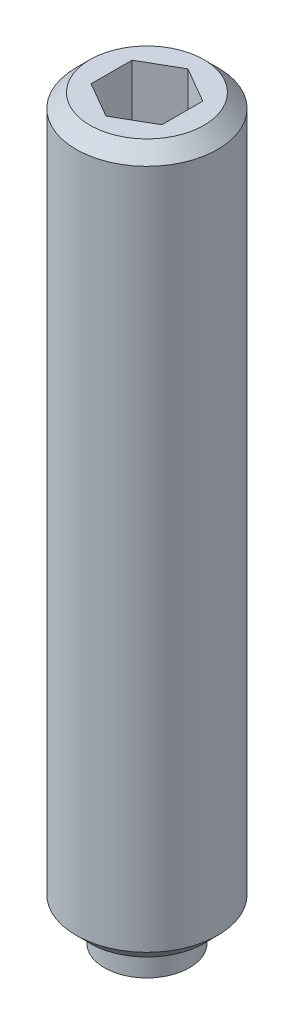
ISO-10303-21;
HEADER;
FILE_DESCRIPTION(('STEP AP214'),'2;1');
FILE_NAME('part.step','',(''),(''),'','','');
FILE_SCHEMA(('AUTOMOTIVE_DESIGN { 1 0 10303 214 1 1 1 1 }'));
ENDSEC;
DATA;
#1=APPLICATION_CONTEXT('core data for automotive mechanical design processes');
#2=APPLICATION_PROTOCOL_DEFINITION('international standard','automotive_design',2000,#1);
#3=PRODUCT_CONTEXT('',#1,'mechanical');
#4=PRODUCT('Part','Part','',(#3));
#5=PRODUCT_RELATED_PRODUCT_CATEGORY('part','',(#4));
#6=PRODUCT_DEFINITION_FORMATION('','',#4);
#7=PRODUCT_DEFINITION_CONTEXT('part definition',#1,'design');
#8=PRODUCT_DEFINITION('design','',#6,#7);
#9=PRODUCT_DEFINITION_SHAPE('','',#8);
#10=(LENGTH_UNIT() NAMED_UNIT(*) SI_UNIT(.MILLI.,.METRE.));
#11=(NAMED_UNIT(*) PLANE_ANGLE_UNIT() SI_UNIT($,.RADIAN.));
#12=(NAMED_UNIT(*) SI_UNIT($,.STERADIAN.) SOLID_ANGLE_UNIT());
#13=UNCERTAINTY_MEASURE_WITH_UNIT(LENGTH_MEASURE(1.E-05),#10,'distance_accuracy_value','');
#14=(GEOMETRIC_REPRESENTATION_CONTEXT(3) GLOBAL_UNCERTAINTY_ASSIGNED_CONTEXT((#13)) GLOBAL_UNIT_ASSIGNED_CONTEXT((#10,
#11,#12)) REPRESENTATION_CONTEXT('',''));
#15=CARTESIAN_POINT('',(0.,0.,0.));
#16=DIRECTION('',(0.,0.,1.));
#17=DIRECTION('',(1.,0.,0.));
#18=AXIS2_PLACEMENT_3D('',#15,#16,#17);
#19=CARTESIAN_POINT('',(1.00475,26.,0.));
#20=DIRECTION('',(0.,1.,0.));
#21=DIRECTION('',(1.,0.,0.));
#22=AXIS2_PLACEMENT_3D('',#19,#20,#21);
#23=PLANE('',#22);
#24=DIRECTION('',(-0.866025403784439,0.,-0.5));
#25=VECTOR('',#24,1.);
#26=CARTESIAN_POINT('',(-0.56071875,26.,1.11964455172189));
#27=LINE('',#26,#25);
#28=CARTESIAN_POINT('',(0.,26.,1.44337567297406));
#29=VERTEX_POINT('',#28);
#30=CARTESIAN_POINT('',(-1.25,26.,0.721687836487032));
#31=VERTEX_POINT('',#30);
#32=EDGE_CURVE('E134',#29,#31,#27,.T.);
#33=ORIENTED_EDGE('',*,*,#32,.T.);
#34=DIRECTION('',(0.,0.,-1.));
#35=VECTOR('',#34,1.);
#36=CARTESIAN_POINT('',(-1.25,26.,-0.360843918243516));
#37=LINE('',#36,#35);
#38=CARTESIAN_POINT('',(-1.25,26.,-0.721687836487032));
#39=VERTEX_POINT('',#38);
#40=EDGE_CURVE('E11',#31,#39,#37,.T.);
#41=ORIENTED_EDGE('',*,*,#40,.T.);
#42=DIRECTION('',(0.866025403784439,0.,-0.5));
#43=VECTOR('',#42,1.);
#44=CARTESIAN_POINT('',(0.06428125,26.,-1.48048846996541));
#45=LINE('',#44,#43);
#46=CARTESIAN_POINT('',(0.,26.,-1.44337567297406));
#47=VERTEX_POINT('',#46);
#48=EDGE_CURVE('E133',#39,#47,#45,.T.);
#49=ORIENTED_EDGE('',*,*,#48,.T.);
#50=DIRECTION('',(0.866025403784439,0.,0.5));
#51=VECTOR('',#50,1.);
#52=CARTESIAN_POINT('',(1.31428125,26.,-0.684575039495687));
#53=LINE('',#52,#51);
#54=CARTESIAN_POINT('',(1.25,26.,-0.721687836487032));
#55=VERTEX_POINT('',#54);
#56=EDGE_CURVE('E20',#47,#55,#53,.T.);
#57=ORIENTED_EDGE('',*,*,#56,.T.);
#58=DIRECTION('',(0.,0.,1.));
#59=VECTOR('',#58,1.);
#60=CARTESIAN_POINT('',(1.25,26.,0.360843918243516));
#61=LINE('',#60,#59);
#62=CARTESIAN_POINT('',(1.25,26.,0.721687836487032));
#63=VERTEX_POINT('',#62);
#64=EDGE_CURVE('E194',#55,#63,#61,.T.);
#65=ORIENTED_EDGE('',*,*,#64,.T.);
#66=DIRECTION('',(-0.866025403784439,0.,0.5));
#67=VECTOR('',#66,1.);
#68=CARTESIAN_POINT('',(0.68928125,26.,1.0454189577392));
#69=LINE('',#68,#67);
#70=EDGE_CURVE('E173',#63,#29,#69,.T.);
#71=ORIENTED_EDGE('',*,*,#70,.T.);
#72=EDGE_LOOP('',(#33,#41,#49,#57,#65,#71));
#73=FACE_BOUND('',#72,.T.);
#74=CARTESIAN_POINT('',(0.,26.,0.));
#75=DIRECTION('',(0.,1.,0.));
#76=DIRECTION('',(1.,0.,0.));
#77=AXIS2_PLACEMENT_3D('',#74,#75,#76);
#78=CIRCLE('',#77,2.0095);
#79=CARTESIAN_POINT('',(-2.0095,26.,0.));
#80=VERTEX_POINT('',#79);
#81=EDGE_CURVE('E244',#80,#80,#78,.T.);
#82=ORIENTED_EDGE('',*,*,#81,.T.);
#83=EDGE_LOOP('',(#82));
#84=FACE_BOUND('',#83,.T.);
#85=ADVANCED_FACE('F16',(#73,#84),#23,.T.);
#86=CARTESIAN_POINT('',(1.75475,1.,0.));
#87=DIRECTION('',(0.,-1.,0.));
#88=DIRECTION('',(0.,0.,-1.));
#89=AXIS2_PLACEMENT_3D('',#86,#87,#88);
#90=PLANE('',#89);
#91=CARTESIAN_POINT('',(0.,1.,0.));
#92=DIRECTION('',(0.,1.,0.));
#93=DIRECTION('',(1.,0.,0.));
#94=AXIS2_PLACEMENT_3D('',#91,#92,#93);
#95=CIRCLE('',#94,1.5);
#96=CARTESIAN_POINT('',(-1.5,1.,0.));
#97=VERTEX_POINT('',#96);
#98=EDGE_CURVE('E102',#97,#97,#95,.T.);
#99=ORIENTED_EDGE('',*,*,#98,.T.);
#100=EDGE_LOOP('',(#99));
#101=FACE_BOUND('',#100,.T.);
#102=CARTESIAN_POINT('',(0.,1.,0.));
#103=DIRECTION('',(0.,1.,0.));
#104=DIRECTION('',(1.,0.,0.));
#105=AXIS2_PLACEMENT_3D('',#102,#103,#104);
#106=CIRCLE('',#105,2.0095);
#107=CARTESIAN_POINT('',(-2.0095,1.,0.));
#108=VERTEX_POINT('',#107);
#109=EDGE_CURVE('E111',#108,#108,#106,.T.);
#110=ORIENTED_EDGE('',*,*,#109,.F.);
#111=EDGE_LOOP('',(#110));
#112=FACE_BOUND('',#111,.T.);
#113=ADVANCED_FACE('F380',(#101,#112),#90,.T.);
#114=CARTESIAN_POINT('',(0.75,0.,0.));
#115=DIRECTION('',(0.,-1.,0.));
#116=DIRECTION('',(0.,0.,-1.));
#117=AXIS2_PLACEMENT_3D('',#114,#115,#116);
#118=PLANE('',#117);
#119=CARTESIAN_POINT('',(0.,0.,0.));
#120=DIRECTION('',(0.,1.,0.));
#121=DIRECTION('',(1.,0.,0.));
#122=AXIS2_PLACEMENT_3D('',#119,#120,#121);
#123=CIRCLE('',#122,1.5);
#124=CARTESIAN_POINT('',(-1.5,0.,0.));
#125=VERTEX_POINT('',#124);
#126=EDGE_CURVE('E166',#125,#125,#123,.T.);
#127=ORIENTED_EDGE('',*,*,#126,.F.);
#128=EDGE_LOOP('',(#127));
#129=FACE_BOUND('',#128,.T.);
#130=ADVANCED_FACE('F385',(#129),#118,.T.);
#131=CARTESIAN_POINT('',(-1.25,28.5,-0.721687836487032));
#132=DIRECTION('',(-1.,0.,0.));
#133=DIRECTION('',(0.,0.,1.));
#134=AXIS2_PLACEMENT_3D('',#131,#132,#133);
#135=PLANE('',#134);
#136=ORIENTED_EDGE('',*,*,#40,.F.);
#137=DIRECTION('',(0.,-1.,0.));
#138=VECTOR('',#137,1.);
#139=CARTESIAN_POINT('',(-1.25,28.5,0.721687836487032));
#140=LINE('',#139,#138);
#141=CARTESIAN_POINT('',(-1.25,23.5,0.721687836487032));
#142=VERTEX_POINT('',#141);
#143=EDGE_CURVE('E124',#31,#142,#140,.T.);
#144=ORIENTED_EDGE('',*,*,#143,.T.);
#145=DIRECTION('',(0.,0.,1.));
#146=VECTOR('',#145,1.);
#147=CARTESIAN_POINT('',(-1.25,23.5,-0.721687836487032));
#148=LINE('',#147,#146);
#149=CARTESIAN_POINT('',(-1.25,23.5,0.));
#150=VERTEX_POINT('',#149);
#151=EDGE_CURVE('E129',#150,#142,#148,.T.);
#152=ORIENTED_EDGE('',*,*,#151,.F.);
#153=DIRECTION('',(0.,0.,1.));
#154=VECTOR('',#153,1.);
#155=CARTESIAN_POINT('',(-1.25,23.5,-0.721687836487032));
#156=LINE('',#155,#154);
#157=CARTESIAN_POINT('',(-1.25,23.5,-0.721687836487032));
#158=VERTEX_POINT('',#157);
#159=EDGE_CURVE('E182',#158,#150,#156,.T.);
#160=ORIENTED_EDGE('',*,*,#159,.F.);
#161=DIRECTION('',(0.,-1.,0.));
#162=VECTOR('',#161,1.);
#163=CARTESIAN_POINT('',(-1.25,28.5,-0.721687836487032));
#164=LINE('',#163,#162);
#165=EDGE_CURVE('E27',#39,#158,#164,.T.);
#166=ORIENTED_EDGE('',*,*,#165,.F.);
#167=EDGE_LOOP('',(#136,#144,#152,#160,#166));
#168=FACE_BOUND('',#167,.T.);
#169=ADVANCED_FACE('F126',(#168),#135,.F.);
#170=CARTESIAN_POINT('',(0.,28.5,-1.44337567297406));
#171=DIRECTION('',(-0.5,0.,-0.866025403784439));
#172=DIRECTION('',(-0.866025403784439,0.,0.5));
#173=AXIS2_PLACEMENT_3D('',#170,#171,#172);
#174=PLANE('',#173);
#175=ORIENTED_EDGE('',*,*,#48,.F.);
#176=ORIENTED_EDGE('',*,*,#165,.T.);
#177=DIRECTION('',(-0.866025403784439,0.,0.5));
#178=VECTOR('',#177,1.);
#179=CARTESIAN_POINT('',(0.,23.5,-1.44337567297406));
#180=LINE('',#179,#178);
#181=CARTESIAN_POINT('',(-0.625,23.5,-1.08253175473055));
#182=VERTEX_POINT('',#181);
#183=EDGE_CURVE('E220',#182,#158,#180,.T.);
#184=ORIENTED_EDGE('',*,*,#183,.F.);
#185=DIRECTION('',(-0.866025403784439,0.,0.5));
#186=VECTOR('',#185,1.);
#187=CARTESIAN_POINT('',(0.,23.5,-1.44337567297406));
#188=LINE('',#187,#186);
#189=CARTESIAN_POINT('',(0.,23.5,-1.44337567297406));
#190=VERTEX_POINT('',#189);
#191=EDGE_CURVE('E181',#190,#182,#188,.T.);
#192=ORIENTED_EDGE('',*,*,#191,.F.);
#193=DIRECTION('',(0.,-1.,0.));
#194=VECTOR('',#193,1.);
#195=CARTESIAN_POINT('',(0.,28.5,-1.44337567297406));
#196=LINE('',#195,#194);
#197=EDGE_CURVE('E195',#47,#190,#196,.T.);
#198=ORIENTED_EDGE('',*,*,#197,.F.);
#199=EDGE_LOOP('',(#175,#176,#184,#192,#198));
#200=FACE_BOUND('',#199,.T.);
#201=ADVANCED_FACE('F340',(#200),#174,.F.);
#202=CARTESIAN_POINT('',(-1.25,28.5,0.721687836487032));
#203=DIRECTION('',(-0.5,0.,0.866025403784439));
#204=DIRECTION('',(0.,1.,0.));
#205=AXIS2_PLACEMENT_3D('',#202,#203,#204);
#206=PLANE('',#205);
#207=ORIENTED_EDGE('',*,*,#32,.F.);
#208=DIRECTION('',(0.,-1.,0.));
#209=VECTOR('',#208,1.);
#210=CARTESIAN_POINT('',(0.,28.5,1.44337567297406));
#211=LINE('',#210,#209);
#212=CARTESIAN_POINT('',(0.,23.5,1.44337567297406));
#213=VERTEX_POINT('',#212);
#214=EDGE_CURVE('E170',#29,#213,#211,.T.);
#215=ORIENTED_EDGE('',*,*,#214,.T.);
#216=DIRECTION('',(0.866025403784439,0.,0.5));
#217=VECTOR('',#216,1.);
#218=CARTESIAN_POINT('',(-1.25,23.5,0.721687836487032));
#219=LINE('',#218,#217);
#220=CARTESIAN_POINT('',(-0.625,23.5,1.08253175473055));
#221=VERTEX_POINT('',#220);
#222=EDGE_CURVE('E141',#221,#213,#219,.T.);
#223=ORIENTED_EDGE('',*,*,#222,.F.);
#224=DIRECTION('',(0.866025403784439,0.,0.5));
#225=VECTOR('',#224,1.);
#226=CARTESIAN_POINT('',(-1.25,23.5,0.721687836487032));
#227=LINE('',#226,#225);
#228=EDGE_CURVE('E138',#142,#221,#227,.T.);
#229=ORIENTED_EDGE('',*,*,#228,.F.);
#230=ORIENTED_EDGE('',*,*,#143,.F.);
#231=EDGE_LOOP('',(#207,#215,#223,#229,#230));
#232=FACE_BOUND('',#231,.T.);
#233=ADVANCED_FACE('F139',(#232),#206,.F.);
#234=CARTESIAN_POINT('',(0.,28.5,1.44337567297406));
#235=DIRECTION('',(0.5,0.,0.866025403784439));
#236=DIRECTION('',(0.,-1.,0.));
#237=AXIS2_PLACEMENT_3D('',#234,#235,#236);
#238=PLANE('',#237);
#239=ORIENTED_EDGE('',*,*,#70,.F.);
#240=DIRECTION('',(0.,-1.,0.));
#241=VECTOR('',#240,1.);
#242=CARTESIAN_POINT('',(1.25,28.5,0.721687836487032));
#243=LINE('',#242,#241);
#244=CARTESIAN_POINT('',(1.25,23.5,0.721687836487032));
#245=VERTEX_POINT('',#244);
#246=EDGE_CURVE('E185',#63,#245,#243,.T.);
#247=ORIENTED_EDGE('',*,*,#246,.T.);
#248=DIRECTION('',(0.866025403784439,0.,-0.5));
#249=VECTOR('',#248,1.);
#250=CARTESIAN_POINT('',(0.,23.5,1.44337567297406));
#251=LINE('',#250,#249);
#252=CARTESIAN_POINT('',(0.625,23.5,1.08253175473055));
#253=VERTEX_POINT('',#252);
#254=EDGE_CURVE('E200',#253,#245,#251,.T.);
#255=ORIENTED_EDGE('',*,*,#254,.F.);
#256=DIRECTION('',(0.866025403784439,0.,-0.5));
#257=VECTOR('',#256,1.);
#258=CARTESIAN_POINT('',(0.,23.5,1.44337567297406));
#259=LINE('',#258,#257);
#260=EDGE_CURVE('E152',#213,#253,#259,.T.);
#261=ORIENTED_EDGE('',*,*,#260,.F.);
#262=ORIENTED_EDGE('',*,*,#214,.F.);
#263=EDGE_LOOP('',(#239,#247,#255,#261,#262));
#264=FACE_BOUND('',#263,.T.);
#265=ADVANCED_FACE('F258',(#264),#238,.F.);
#266=CARTESIAN_POINT('',(1.25,28.5,0.721687836487032));
#267=DIRECTION('',(1.,0.,0.));
#268=DIRECTION('',(0.,1.,0.));
#269=AXIS2_PLACEMENT_3D('',#266,#267,#268);
#270=PLANE('',#269);
#271=ORIENTED_EDGE('',*,*,#64,.F.);
#272=DIRECTION('',(0.,-1.,0.));
#273=VECTOR('',#272,1.);
#274=CARTESIAN_POINT('',(1.25,28.5,-0.721687836487032));
#275=LINE('',#274,#273);
#276=CARTESIAN_POINT('',(1.25,23.5,-0.721687836487032));
#277=VERTEX_POINT('',#276);
#278=EDGE_CURVE('E191',#55,#277,#275,.T.);
#279=ORIENTED_EDGE('',*,*,#278,.T.);
#280=DIRECTION('',(0.,0.,-1.));
#281=VECTOR('',#280,1.);
#282=CARTESIAN_POINT('',(1.25,23.5,0.721687836487032));
#283=LINE('',#282,#281);
#284=CARTESIAN_POINT('',(1.25,23.5,0.));
#285=VERTEX_POINT('',#284);
#286=EDGE_CURVE('E211',#285,#277,#283,.T.);
#287=ORIENTED_EDGE('',*,*,#286,.F.);
#288=DIRECTION('',(0.,0.,-1.));
#289=VECTOR('',#288,1.);
#290=CARTESIAN_POINT('',(1.25,23.5,0.721687836487032));
#291=LINE('',#290,#289);
#292=EDGE_CURVE('E204',#245,#285,#291,.T.);
#293=ORIENTED_EDGE('',*,*,#292,.F.);
#294=ORIENTED_EDGE('',*,*,#246,.F.);
#295=EDGE_LOOP('',(#271,#279,#287,#293,#294));
#296=FACE_BOUND('',#295,.T.);
#297=ADVANCED_FACE('F265',(#296),#270,.F.);
#298=CARTESIAN_POINT('',(1.25,28.5,-0.721687836487032));
#299=DIRECTION('',(0.5,0.,-0.866025403784439));
#300=DIRECTION('',(0.,-1.,0.));
#301=AXIS2_PLACEMENT_3D('',#298,#299,#300);
#302=PLANE('',#301);
#303=ORIENTED_EDGE('',*,*,#56,.F.);
#304=ORIENTED_EDGE('',*,*,#197,.T.);
#305=DIRECTION('',(-0.866025403784439,0.,-0.5));
#306=VECTOR('',#305,1.);
#307=CARTESIAN_POINT('',(1.25,23.5,-0.721687836487032));
#308=LINE('',#307,#306);
#309=CARTESIAN_POINT('',(0.625,23.5,-1.08253175473055));
#310=VERTEX_POINT('',#309);
#311=EDGE_CURVE('E177',#310,#190,#308,.T.);
#312=ORIENTED_EDGE('',*,*,#311,.F.);
#313=DIRECTION('',(-0.866025403784439,0.,-0.5));
#314=VECTOR('',#313,1.);
#315=CARTESIAN_POINT('',(1.25,23.5,-0.721687836487032));
#316=LINE('',#315,#314);
#317=EDGE_CURVE('E205',#277,#310,#316,.T.);
#318=ORIENTED_EDGE('',*,*,#317,.F.);
#319=ORIENTED_EDGE('',*,*,#278,.F.);
#320=EDGE_LOOP('',(#303,#304,#312,#318,#319));
#321=FACE_BOUND('',#320,.T.);
#322=ADVANCED_FACE('F303',(#321),#302,.F.);
#323=CARTESIAN_POINT('',(0.,23.5,0.));
#324=DIRECTION('',(0.,1.,0.));
#325=DIRECTION('',(1.,0.,0.));
#326=AXIS2_PLACEMENT_3D('',#323,#324,#325);
#327=PLANE('',#326);
#328=CARTESIAN_POINT('',(0.,23.5,0.));
#329=DIRECTION('',(0.,-1.,0.));
#330=DIRECTION('',(1.,0.,0.));
#331=AXIS2_PLACEMENT_3D('',#328,#329,#330);
#332=CIRCLE('',#331,1.25);
#333=EDGE_CURVE('E149',#221,#150,#332,.T.);
#334=ORIENTED_EDGE('',*,*,#333,.T.);
#335=ORIENTED_EDGE('',*,*,#151,.T.);
#336=ORIENTED_EDGE('',*,*,#228,.T.);
#337=EDGE_LOOP('',(#334,#335,#336));
#338=FACE_BOUND('',#337,.T.);
#339=ADVANCED_FACE('F147',(#338),#327,.T.);
#340=CARTESIAN_POINT('',(0.,23.5,0.));
#341=DIRECTION('',(0.,1.,0.));
#342=DIRECTION('',(1.,0.,0.));
#343=AXIS2_PLACEMENT_3D('',#340,#341,#342);
#344=PLANE('',#343);
#345=CARTESIAN_POINT('',(0.,23.5,0.));
#346=DIRECTION('',(0.,-1.,0.));
#347=DIRECTION('',(1.,0.,0.));
#348=AXIS2_PLACEMENT_3D('',#345,#346,#347);
#349=CIRCLE('',#348,1.25);
#350=EDGE_CURVE('E218',#253,#221,#349,.T.);
#351=ORIENTED_EDGE('',*,*,#350,.T.);
#352=ORIENTED_EDGE('',*,*,#222,.T.);
#353=ORIENTED_EDGE('',*,*,#260,.T.);
#354=EDGE_LOOP('',(#351,#352,#353));
#355=FACE_BOUND('',#354,.T.);
#356=ADVANCED_FACE('F367',(#355),#344,.T.);
#357=CARTESIAN_POINT('',(0.,23.5,0.));
#358=DIRECTION('',(0.,1.,0.));
#359=DIRECTION('',(1.,0.,0.));
#360=AXIS2_PLACEMENT_3D('',#357,#358,#359);
#361=PLANE('',#360);
#362=CARTESIAN_POINT('',(0.,23.5,0.));
#363=DIRECTION('',(0.,-1.,0.));
#364=DIRECTION('',(1.,0.,0.));
#365=AXIS2_PLACEMENT_3D('',#362,#363,#364);
#366=CIRCLE('',#365,1.25);
#367=EDGE_CURVE('E169',#285,#253,#366,.T.);
#368=ORIENTED_EDGE('',*,*,#367,.T.);
#369=ORIENTED_EDGE('',*,*,#254,.T.);
#370=ORIENTED_EDGE('',*,*,#292,.T.);
#371=EDGE_LOOP('',(#368,#369,#370));
#372=FACE_BOUND('',#371,.T.);
#373=ADVANCED_FACE('F267',(#372),#361,.T.);
#374=CARTESIAN_POINT('',(0.,23.5,0.));
#375=DIRECTION('',(0.,1.,0.));
#376=DIRECTION('',(1.,0.,0.));
#377=AXIS2_PLACEMENT_3D('',#374,#375,#376);
#378=PLANE('',#377);
#379=CARTESIAN_POINT('',(0.,23.5,0.));
#380=DIRECTION('',(0.,-1.,0.));
#381=DIRECTION('',(1.,0.,0.));
#382=AXIS2_PLACEMENT_3D('',#379,#380,#381);
#383=CIRCLE('',#382,1.25);
#384=EDGE_CURVE('E199',#310,#285,#383,.T.);
#385=ORIENTED_EDGE('',*,*,#384,.T.);
#386=ORIENTED_EDGE('',*,*,#286,.T.);
#387=ORIENTED_EDGE('',*,*,#317,.T.);
#388=EDGE_LOOP('',(#385,#386,#387));
#389=FACE_BOUND('',#388,.T.);
#390=ADVANCED_FACE('F414',(#389),#378,.T.);
#391=CARTESIAN_POINT('',(0.,23.5,0.));
#392=DIRECTION('',(0.,1.,0.));
#393=DIRECTION('',(1.,0.,0.));
#394=AXIS2_PLACEMENT_3D('',#391,#392,#393);
#395=PLANE('',#394);
#396=CARTESIAN_POINT('',(0.,23.5,0.));
#397=DIRECTION('',(0.,-1.,0.));
#398=DIRECTION('',(1.,0.,0.));
#399=AXIS2_PLACEMENT_3D('',#396,#397,#398);
#400=CIRCLE('',#399,1.25);
#401=EDGE_CURVE('E165',#182,#310,#400,.T.);
#402=ORIENTED_EDGE('',*,*,#401,.T.);
#403=ORIENTED_EDGE('',*,*,#311,.T.);
#404=ORIENTED_EDGE('',*,*,#191,.T.);
#405=EDGE_LOOP('',(#402,#403,#404));
#406=FACE_BOUND('',#405,.T.);
#407=ADVANCED_FACE('F419',(#406),#395,.T.);
#408=CARTESIAN_POINT('',(0.,23.5,0.));
#409=DIRECTION('',(0.,1.,0.));
#410=DIRECTION('',(1.,0.,0.));
#411=AXIS2_PLACEMENT_3D('',#408,#409,#410);
#412=PLANE('',#411);
#413=CARTESIAN_POINT('',(0.,23.5,0.));
#414=DIRECTION('',(0.,-1.,0.));
#415=DIRECTION('',(1.,0.,0.));
#416=AXIS2_PLACEMENT_3D('',#413,#414,#415);
#417=CIRCLE('',#416,1.25);
#418=EDGE_CURVE('E162',#150,#182,#417,.T.);
#419=ORIENTED_EDGE('',*,*,#418,.T.);
#420=ORIENTED_EDGE('',*,*,#183,.T.);
#421=ORIENTED_EDGE('',*,*,#159,.T.);
#422=EDGE_LOOP('',(#419,#420,#421));
#423=FACE_BOUND('',#422,.T.);
#424=ADVANCED_FACE('F295',(#423),#412,.T.);
#425=CARTESIAN_POINT('',(0.,23.1391560817565,0.));
#426=DIRECTION('',(0.,1.,0.));
#427=DIRECTION('',(1.,0.,0.));
#428=AXIS2_PLACEMENT_3D('',#425,#426,#427);
#429=CONICAL_SURFACE('',#428,0.625,1.0471975511966);
#430=CARTESIAN_POINT('',(0.,22.778312163513,0.));
#431=VERTEX_POINT('',#430);
#432=VERTEX_LOOP('',#431);
#433=FACE_BOUND('',#432,.T.);
#434=ORIENTED_EDGE('',*,*,#367,.F.);
#435=ORIENTED_EDGE('',*,*,#384,.F.);
#436=ORIENTED_EDGE('',*,*,#401,.F.);
#437=ORIENTED_EDGE('',*,*,#418,.F.);
#438=ORIENTED_EDGE('',*,*,#333,.F.);
#439=ORIENTED_EDGE('',*,*,#350,.F.);
#440=EDGE_LOOP('',(#434,#435,#436,#437,#438,#439));
#441=FACE_BOUND('',#440,.T.);
#442=ADVANCED_FACE('F18',(#433,#441),#429,.F.);
#443=CARTESIAN_POINT('',(0.,0.5,0.));
#444=DIRECTION('',(0.,-1.,0.));
#445=DIRECTION('',(1.,0.,0.));
#446=AXIS2_PLACEMENT_3D('',#443,#444,#445);
#447=CYLINDRICAL_SURFACE('',#446,1.5);
#448=ORIENTED_EDGE('',*,*,#126,.T.);
#449=EDGE_LOOP('',(#448));
#450=FACE_BOUND('',#449,.T.);
#451=ORIENTED_EDGE('',*,*,#98,.F.);
#452=EDGE_LOOP('',(#451));
#453=FACE_BOUND('',#452,.T.);
#454=ADVANCED_FACE('F294',(#450,#453),#447,.T.);
#455=CARTESIAN_POINT('',(0.,1.24525,0.));
#456=DIRECTION('',(0.,1.,0.));
#457=DIRECTION('',(1.,0.,0.));
#458=AXIS2_PLACEMENT_3D('',#455,#456,#457);
#459=CONICAL_SURFACE('',#458,2.25475,0.785398163397447);
#460=ORIENTED_EDGE('',*,*,#109,.T.);
#461=EDGE_LOOP('',(#460));
#462=FACE_BOUND('',#461,.T.);
#463=CARTESIAN_POINT('',(0.,1.4905,0.));
#464=DIRECTION('',(0.,1.,0.));
#465=DIRECTION('',(1.,0.,0.));
#466=AXIS2_PLACEMENT_3D('',#463,#464,#465);
#467=CIRCLE('',#466,2.5);
#468=CARTESIAN_POINT('',(-2.5,1.4905,0.));
#469=VERTEX_POINT('',#468);
#470=EDGE_CURVE('E174',#469,#469,#467,.T.);
#471=ORIENTED_EDGE('',*,*,#470,.F.);
#472=EDGE_LOOP('',(#471));
#473=FACE_BOUND('',#472,.T.);
#474=ADVANCED_FACE('F317',(#462,#473),#459,.T.);
#475=CARTESIAN_POINT('',(0.,13.5,0.));
#476=DIRECTION('',(0.,-1.,0.));
#477=DIRECTION('',(1.,0.,0.));
#478=AXIS2_PLACEMENT_3D('',#475,#476,#477);
#479=CYLINDRICAL_SURFACE('',#478,2.5);
#480=ORIENTED_EDGE('',*,*,#470,.T.);
#481=EDGE_LOOP('',(#480));
#482=FACE_BOUND('',#481,.T.);
#483=CARTESIAN_POINT('',(0.,25.5095,0.));
#484=DIRECTION('',(0.,1.,0.));
#485=DIRECTION('',(1.,0.,0.));
#486=AXIS2_PLACEMENT_3D('',#483,#484,#485);
#487=CIRCLE('',#486,2.5);
#488=CARTESIAN_POINT('',(-2.5,25.5095,0.));
#489=VERTEX_POINT('',#488);
#490=EDGE_CURVE('E161',#489,#489,#487,.T.);
#491=ORIENTED_EDGE('',*,*,#490,.F.);
#492=EDGE_LOOP('',(#491));
#493=FACE_BOUND('',#492,.T.);
#494=ADVANCED_FACE('F324',(#482,#493),#479,.T.);
#495=CARTESIAN_POINT('',(0.,25.75475,0.));
#496=DIRECTION('',(0.,-1.,0.));
#497=DIRECTION('',(1.,0.,0.));
#498=AXIS2_PLACEMENT_3D('',#495,#496,#497);
#499=CONICAL_SURFACE('',#498,2.25475,0.785398163397447);
#500=ORIENTED_EDGE('',*,*,#490,.T.);
#501=EDGE_LOOP('',(#500));
#502=FACE_BOUND('',#501,.T.);
#503=ORIENTED_EDGE('',*,*,#81,.F.);
#504=EDGE_LOOP('',(#503));
#505=FACE_BOUND('',#504,.T.);
#506=ADVANCED_FACE('F329',(#502,#505),#499,.T.);
#507=CLOSED_SHELL('',(#85,#113,#130,#169,#201,#233,#265,#297,#322,#339,#356,#373,#390,#407,#424,
#442,#454,#474,#494,#506));
#508=MANIFOLD_SOLID_BREP('B1',#507);
#509=ADVANCED_BREP_SHAPE_REPRESENTATION('',(#18,#508),#14);
#510=SHAPE_DEFINITION_REPRESENTATION(#9,#509);
ENDSEC;
END-ISO-10303-21;
